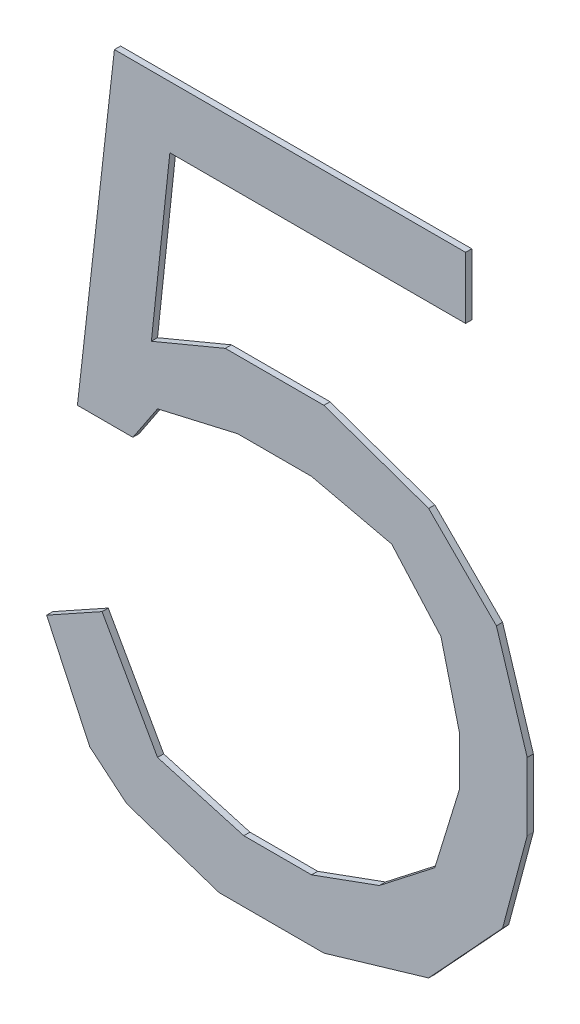
ISO-10303-21;
HEADER;
FILE_DESCRIPTION(('STEP AP214'),'2;1');
FILE_NAME('part.step','',(''),(''),'','','');
FILE_SCHEMA(('AUTOMOTIVE_DESIGN { 1 0 10303 214 1 1 1 1 }'));
ENDSEC;
DATA;
#1=APPLICATION_CONTEXT('core data for automotive mechanical design processes');
#2=APPLICATION_PROTOCOL_DEFINITION('international standard','automotive_design',2000,#1);
#3=PRODUCT_CONTEXT('',#1,'mechanical');
#4=PRODUCT('Part','Part','',(#3));
#5=PRODUCT_RELATED_PRODUCT_CATEGORY('part','',(#4));
#6=PRODUCT_DEFINITION_FORMATION('','',#4);
#7=PRODUCT_DEFINITION_CONTEXT('part definition',#1,'design');
#8=PRODUCT_DEFINITION('design','',#6,#7);
#9=PRODUCT_DEFINITION_SHAPE('','',#8);
#10=(LENGTH_UNIT() NAMED_UNIT(*) SI_UNIT(.MILLI.,.METRE.));
#11=(NAMED_UNIT(*) PLANE_ANGLE_UNIT() SI_UNIT($,.RADIAN.));
#12=(NAMED_UNIT(*) SI_UNIT($,.STERADIAN.) SOLID_ANGLE_UNIT());
#13=UNCERTAINTY_MEASURE_WITH_UNIT(LENGTH_MEASURE(1.E-05),#10,'distance_accuracy_value','');
#14=(GEOMETRIC_REPRESENTATION_CONTEXT(3) GLOBAL_UNCERTAINTY_ASSIGNED_CONTEXT((#13)) GLOBAL_UNIT_ASSIGNED_CONTEXT((#10,
#11,#12)) REPRESENTATION_CONTEXT('',''));
#15=CARTESIAN_POINT('',(0.,0.,0.));
#16=DIRECTION('',(0.,0.,1.));
#17=DIRECTION('',(1.,0.,0.));
#18=AXIS2_PLACEMENT_3D('',#15,#16,#17);
#19=CARTESIAN_POINT('',(0.28999942,0.55000144,0.01));
#20=DIRECTION('',(0.,0.,-1.));
#21=DIRECTION('',(0.,-1.,0.));
#22=AXIS2_PLACEMENT_3D('',#19,#20,#21);
#23=PLANE('',#22);
#24=DIRECTION('',(0.112488483006039,0.993653028572348,0.));
#25=VECTOR('',#24,1.);
#26=CARTESIAN_POINT('',(-0.33999932,0.01999995999999,0.01));
#27=LINE('',#26,#25);
#28=CARTESIAN_POINT('',(-0.33999932,0.01999996,0.01));
#29=VERTEX_POINT('',#28);
#30=CARTESIAN_POINT('',(-0.27999944,0.55000144,0.01));
#31=VERTEX_POINT('',#30);
#32=EDGE_CURVE('E481',#29,#31,#27,.T.);
#33=ORIENTED_EDGE('',*,*,#32,.F.);
#34=DIRECTION('',(-1.,0.,0.));
#35=VECTOR('',#34,1.);
#36=CARTESIAN_POINT('',(0.28999942,0.01999995999999,0.01));
#37=LINE('',#36,#35);
#38=CARTESIAN_POINT('',(-0.2499995,0.01999995999999,0.01));
#39=VERTEX_POINT('',#38);
#40=EDGE_CURVE('E333',#39,#29,#37,.T.);
#41=ORIENTED_EDGE('',*,*,#40,.F.);
#42=DIRECTION('',(-0.554700196224998,-0.832050294337998,0.));
#43=VECTOR('',#42,1.);
#44=CARTESIAN_POINT('',(-0.20999958,0.07999984,0.01));
#45=LINE('',#44,#43);
#46=CARTESIAN_POINT('',(-0.20999958,0.07999984,0.01));
#47=VERTEX_POINT('',#46);
#48=EDGE_CURVE('E330',#47,#39,#45,.T.);
#49=ORIENTED_EDGE('',*,*,#48,.F.);
#50=DIRECTION('',(-0.974391195694586,-0.224859506698904,0.));
#51=VECTOR('',#50,1.);
#52=CARTESIAN_POINT('',(-0.07999984,0.10999978,0.01));
#53=LINE('',#52,#51);
#54=CARTESIAN_POINT('',(-0.07999984,0.10999978,0.01));
#55=VERTEX_POINT('',#54);
#56=EDGE_CURVE('E478',#55,#47,#53,.T.);
#57=ORIENTED_EDGE('',*,*,#56,.F.);
#58=DIRECTION('',(-1.,0.,0.));
#59=VECTOR('',#58,1.);
#60=CARTESIAN_POINT('',(0.28999942,0.10999978,0.01));
#61=LINE('',#60,#59);
#62=CARTESIAN_POINT('',(0.03999992,0.10999978,0.01));
#63=VERTEX_POINT('',#62);
#64=EDGE_CURVE('E465',#63,#55,#61,.T.);
#65=ORIENTED_EDGE('',*,*,#64,.F.);
#66=DIRECTION('',(-0.974391195694586,0.224859506698904,0.));
#67=VECTOR('',#66,1.);
#68=CARTESIAN_POINT('',(0.16999966,0.07999984,0.01));
#69=LINE('',#68,#67);
#70=CARTESIAN_POINT('',(0.16999966,0.07999984,0.01));
#71=VERTEX_POINT('',#70);
#72=EDGE_CURVE('E466',#71,#63,#69,.T.);
#73=ORIENTED_EDGE('',*,*,#72,.F.);
#74=DIRECTION('',(-0.664363838829796,0.74740931868377,0.));
#75=VECTOR('',#74,1.);
#76=CARTESIAN_POINT('',(0.2499995,-0.009999980000003,0.01));
#77=LINE('',#76,#75);
#78=CARTESIAN_POINT('',(0.2499995,-0.009999980000006,0.01));
#79=VERTEX_POINT('',#78);
#80=EDGE_CURVE('E571',#79,#71,#77,.T.);
#81=ORIENTED_EDGE('',*,*,#80,.F.);
#82=DIRECTION('',(-0.242535625036098,0.970142500145391,0.));
#83=VECTOR('',#82,1.);
#84=CARTESIAN_POINT('',(0.27999944,-0.12999974,0.01));
#85=LINE('',#84,#83);
#86=CARTESIAN_POINT('',(0.27999944,-0.12999974,0.01));
#87=VERTEX_POINT('',#86);
#88=EDGE_CURVE('E510',#87,#79,#85,.T.);
#89=ORIENTED_EDGE('',*,*,#88,.F.);
#90=DIRECTION('',(0.,1.,0.));
#91=VECTOR('',#90,1.);
#92=CARTESIAN_POINT('',(0.27999944,0.55000144,0.01));
#93=LINE('',#92,#91);
#94=CARTESIAN_POINT('',(0.27999944,-0.20999958,0.01));
#95=VERTEX_POINT('',#94);
#96=EDGE_CURVE('E509',#95,#87,#93,.T.);
#97=ORIENTED_EDGE('',*,*,#96,.F.);
#98=DIRECTION('',(0.294085848837945,0.95577900872182,0.));
#99=VECTOR('',#98,1.);
#100=CARTESIAN_POINT('',(0.23999952,-0.33999932,0.01));
#101=LINE('',#100,#99);
#102=CARTESIAN_POINT('',(0.23999952,-0.33999932,0.01));
#103=VERTEX_POINT('',#102);
#104=EDGE_CURVE('E360',#103,#95,#101,.T.);
#105=ORIENTED_EDGE('',*,*,#104,.F.);
#106=DIRECTION('',(0.789352217376165,0.613940613515128,0.));
#107=VECTOR('',#106,1.);
#108=CARTESIAN_POINT('',(0.1499997,-0.40999918,0.01));
#109=LINE('',#108,#107);
#110=CARTESIAN_POINT('',(0.1499997,-0.40999918,0.01));
#111=VERTEX_POINT('',#110);
#112=EDGE_CURVE('E406',#111,#103,#109,.T.);
#113=ORIENTED_EDGE('',*,*,#112,.F.);
#114=DIRECTION('',(0.939793423488291,0.341743063087106,0.));
#115=VECTOR('',#114,1.);
#116=CARTESIAN_POINT('',(0.03999992,-0.4499991,0.01));
#117=LINE('',#116,#115);
#118=CARTESIAN_POINT('',(0.03999992,-0.4499991,0.01));
#119=VERTEX_POINT('',#118);
#120=EDGE_CURVE('E370',#119,#111,#117,.T.);
#121=ORIENTED_EDGE('',*,*,#120,.F.);
#122=DIRECTION('',(1.,0.,0.));
#123=VECTOR('',#122,1.);
#124=CARTESIAN_POINT('',(0.28999942,-0.4499991,0.01));
#125=LINE('',#124,#123);
#126=CARTESIAN_POINT('',(-0.06999986,-0.4499991,0.01));
#127=VERTEX_POINT('',#126);
#128=EDGE_CURVE('E519',#127,#119,#125,.T.);
#129=ORIENTED_EDGE('',*,*,#128,.F.);
#130=DIRECTION('',(0.961523947640936,-0.274721127896982,0.));
#131=VECTOR('',#130,1.);
#132=CARTESIAN_POINT('',(-0.20999958,-0.40999918,0.01));
#133=LINE('',#132,#131);
#134=CARTESIAN_POINT('',(-0.20999958,-0.40999918,0.01));
#135=VERTEX_POINT('',#134);
#136=EDGE_CURVE('E458',#135,#127,#133,.T.);
#137=ORIENTED_EDGE('',*,*,#136,.F.);
#138=DIRECTION('',(0.490261239632702,-0.871575537124469,0.));
#139=VECTOR('',#138,1.);
#140=CARTESIAN_POINT('',(-0.2999994,-0.2499995,0.01));
#141=LINE('',#140,#139);
#142=CARTESIAN_POINT('',(-0.2999994,-0.2499995,0.01));
#143=VERTEX_POINT('',#142);
#144=EDGE_CURVE('E459',#143,#135,#141,.T.);
#145=ORIENTED_EDGE('',*,*,#144,.F.);
#146=DIRECTION('',(0.874157276121491,0.485642931178717,0.));
#147=VECTOR('',#146,1.);
#148=CARTESIAN_POINT('',(-0.38999922,-0.2999994,0.01));
#149=LINE('',#148,#147);
#150=CARTESIAN_POINT('',(-0.38999922,-0.2999994,0.01));
#151=VERTEX_POINT('',#150);
#152=EDGE_CURVE('E612',#151,#143,#149,.T.);
#153=ORIENTED_EDGE('',*,*,#152,.F.);
#154=DIRECTION('',(-0.422885465331124,0.906183139995265,0.));
#155=VECTOR('',#154,1.);
#156=CARTESIAN_POINT('',(-0.31999936,-0.4499991,0.01));
#157=LINE('',#156,#155);
#158=CARTESIAN_POINT('',(-0.31999936,-0.4499991,0.01));
#159=VERTEX_POINT('',#158);
#160=EDGE_CURVE('E381',#159,#151,#157,.T.);
#161=ORIENTED_EDGE('',*,*,#160,.F.);
#162=DIRECTION('',(-0.768221279597458,0.640184399664382,0.));
#163=VECTOR('',#162,1.);
#164=CARTESIAN_POINT('',(-0.25999948,-0.499999,0.01));
#165=LINE('',#164,#163);
#166=CARTESIAN_POINT('',(-0.25999948,-0.499999,0.01));
#167=VERTEX_POINT('',#166);
#168=EDGE_CURVE('E450',#167,#159,#165,.T.);
#169=ORIENTED_EDGE('',*,*,#168,.F.);
#170=DIRECTION('',(-0.948683298050514,0.316227766016838,0.));
#171=VECTOR('',#170,1.);
#172=CARTESIAN_POINT('',(-0.10999978,-0.5499989,0.01));
#173=LINE('',#172,#171);
#174=CARTESIAN_POINT('',(-0.10999978,-0.5499989,0.01));
#175=VERTEX_POINT('',#174);
#176=EDGE_CURVE('E605',#175,#167,#173,.T.);
#177=ORIENTED_EDGE('',*,*,#176,.F.);
#178=DIRECTION('',(-1.,0.,0.));
#179=VECTOR('',#178,1.);
#180=CARTESIAN_POINT('',(0.28999942,-0.5499989,0.01));
#181=LINE('',#180,#179);
#182=CARTESIAN_POINT('',(0.05999988000001,-0.5499989,0.01));
#183=VERTEX_POINT('',#182);
#184=EDGE_CURVE('E359',#183,#175,#181,.T.);
#185=ORIENTED_EDGE('',*,*,#184,.F.);
#186=DIRECTION('',(-0.959365501571127,-0.282166323992038,0.));
#187=VECTOR('',#186,1.);
#188=CARTESIAN_POINT('',(0.22999954,-0.499999,0.01));
#189=LINE('',#188,#187);
#190=CARTESIAN_POINT('',(0.22999954,-0.499999,0.01));
#191=VERTEX_POINT('',#190);
#192=EDGE_CURVE('E351',#191,#183,#189,.T.);
#193=ORIENTED_EDGE('',*,*,#192,.F.);
#194=DIRECTION('',(-0.678280102733274,-0.734803444627296,0.));
#195=VECTOR('',#194,1.);
#196=CARTESIAN_POINT('',(0.3499993,-0.36999926,0.01));
#197=LINE('',#196,#195);
#198=CARTESIAN_POINT('',(0.3499993,-0.36999926,0.01));
#199=VERTEX_POINT('',#198);
#200=EDGE_CURVE('E518',#199,#191,#197,.T.);
#201=ORIENTED_EDGE('',*,*,#200,.F.);
#202=DIRECTION('',(-0.257662650560083,-0.966234939601313,0.));
#203=VECTOR('',#202,1.);
#204=CARTESIAN_POINT('',(0.38999922,-0.21999956,0.01));
#205=LINE('',#204,#203);
#206=CARTESIAN_POINT('',(0.38999922,-0.21999956,0.01));
#207=VERTEX_POINT('',#206);
#208=EDGE_CURVE('E416',#207,#199,#205,.T.);
#209=ORIENTED_EDGE('',*,*,#208,.F.);
#210=DIRECTION('',(0.,-1.,0.));
#211=VECTOR('',#210,1.);
#212=CARTESIAN_POINT('',(0.38999922,0.55000144,0.01));
#213=LINE('',#212,#211);
#214=CARTESIAN_POINT('',(0.38999922,-0.10999978,0.01));
#215=VERTEX_POINT('',#214);
#216=EDGE_CURVE('E410',#215,#207,#213,.T.);
#217=ORIENTED_EDGE('',*,*,#216,.F.);
#218=DIRECTION('',(0.298274993136004,-0.954479978035012,0.));
#219=VECTOR('',#218,1.);
#220=CARTESIAN_POINT('',(0.33999932,0.04999989999999,0.01));
#221=LINE('',#220,#219);
#222=CARTESIAN_POINT('',(0.33999932,0.04999989999999,0.01));
#223=VERTEX_POINT('',#222);
#224=EDGE_CURVE('E303',#223,#215,#221,.T.);
#225=ORIENTED_EDGE('',*,*,#224,.F.);
#226=DIRECTION('',(0.707098617347921,-0.707114944930921,0.));
#227=VECTOR('',#226,1.);
#228=CARTESIAN_POINT('',(0.22999954,0.16000222,0.01));
#229=LINE('',#228,#227);
#230=CARTESIAN_POINT('',(0.22999954,0.16000222,0.01));
#231=VERTEX_POINT('',#230);
#232=EDGE_CURVE('E296',#231,#223,#229,.T.);
#233=ORIENTED_EDGE('',*,*,#232,.F.);
#234=DIRECTION('',(0.942990333582945,-0.332820117734981,0.));
#235=VECTOR('',#234,1.);
#236=CARTESIAN_POINT('',(0.05999988000001,0.2200021,0.01));
#237=LINE('',#236,#235);
#238=CARTESIAN_POINT('',(0.05999988000001,0.2200021,0.01));
#239=VERTEX_POINT('',#238);
#240=EDGE_CURVE('E299',#239,#231,#237,.T.);
#241=ORIENTED_EDGE('',*,*,#240,.F.);
#242=DIRECTION('',(1.,0.,0.));
#243=VECTOR('',#242,1.);
#244=CARTESIAN_POINT('',(0.28999942,0.2200021,0.01));
#245=LINE('',#244,#243);
#246=CARTESIAN_POINT('',(-0.09999979999999,0.2200021,0.01));
#247=VERTEX_POINT('',#246);
#248=EDGE_CURVE('E327',#247,#239,#245,.T.);
#249=ORIENTED_EDGE('',*,*,#248,.F.);
#250=DIRECTION('',(0.923076923077071,0.38461538461503,0.));
#251=VECTOR('',#250,1.);
#252=CARTESIAN_POINT('',(-0.21999956,0.1700022,0.01));
#253=LINE('',#252,#251);
#254=CARTESIAN_POINT('',(-0.21999956,0.1700022,0.01));
#255=VERTEX_POINT('',#254);
#256=EDGE_CURVE('E495',#255,#247,#253,.T.);
#257=ORIENTED_EDGE('',*,*,#256,.F.);
#258=DIRECTION('',(-0.106533123633983,-0.994309153919839,0.));
#259=VECTOR('',#258,1.);
#260=CARTESIAN_POINT('',(-0.18999962,0.45000164,0.01));
#261=LINE('',#260,#259);
#262=CARTESIAN_POINT('',(-0.18999962,0.45000164,0.01));
#263=VERTEX_POINT('',#262);
#264=EDGE_CURVE('E502',#263,#255,#261,.T.);
#265=ORIENTED_EDGE('',*,*,#264,.F.);
#266=DIRECTION('',(-1.,0.,0.));
#267=VECTOR('',#266,1.);
#268=CARTESIAN_POINT('',(0.28999942,0.45000164,0.01));
#269=LINE('',#268,#267);
#270=CARTESIAN_POINT('',(0.28999942,0.45000164,0.01));
#271=VERTEX_POINT('',#270);
#272=EDGE_CURVE('E487',#271,#263,#269,.T.);
#273=ORIENTED_EDGE('',*,*,#272,.F.);
#274=DIRECTION('',(0.,-1.,0.));
#275=VECTOR('',#274,1.);
#276=CARTESIAN_POINT('',(0.28999942,0.55000144,0.01));
#277=LINE('',#276,#275);
#278=CARTESIAN_POINT('',(0.28999942,0.55000144,0.01));
#279=VERTEX_POINT('',#278);
#280=EDGE_CURVE('E437',#279,#271,#277,.T.);
#281=ORIENTED_EDGE('',*,*,#280,.F.);
#282=DIRECTION('',(1.,0.,0.));
#283=VECTOR('',#282,1.);
#284=CARTESIAN_POINT('',(0.28999942,0.55000144,0.01));
#285=LINE('',#284,#283);
#286=EDGE_CURVE('E11',#31,#279,#285,.T.);
#287=ORIENTED_EDGE('',*,*,#286,.F.);
#288=EDGE_LOOP('',(#33,#41,#49,#57,#65,#73,#81,#89,#97,#105,#113,#121,#129,#137,#145,#153,#161,
#169,#177,#185,#193,#201,#209,#217,#225,#233,#241,#249,#257,#265,#273,#281,#287));
#289=FACE_BOUND('',#288,.T.);
#290=ADVANCED_FACE('F17',(#289),#23,.F.);
#291=CARTESIAN_POINT('',(0.28999942,0.55000144,0.));
#292=DIRECTION('',(0.,-1.,0.));
#293=DIRECTION('',(0.,0.,-1.));
#294=AXIS2_PLACEMENT_3D('',#291,#292,#293);
#295=PLANE('',#294);
#296=DIRECTION('',(0.,0.,-1.));
#297=VECTOR('',#296,1.);
#298=CARTESIAN_POINT('',(-0.27999944,0.55000144,0.));
#299=LINE('',#298,#297);
#300=CARTESIAN_POINT('',(-0.27999944,0.55000144,0.));
#301=VERTEX_POINT('',#300);
#302=EDGE_CURVE('E28',#31,#301,#299,.T.);
#303=ORIENTED_EDGE('',*,*,#302,.F.);
#304=ORIENTED_EDGE('',*,*,#286,.T.);
#305=DIRECTION('',(0.,0.,1.));
#306=VECTOR('',#305,1.);
#307=CARTESIAN_POINT('',(0.28999942,0.55000144,0.));
#308=LINE('',#307,#306);
#309=CARTESIAN_POINT('',(0.28999942,0.55000144,0.));
#310=VERTEX_POINT('',#309);
#311=EDGE_CURVE('E433',#310,#279,#308,.T.);
#312=ORIENTED_EDGE('',*,*,#311,.F.);
#313=DIRECTION('',(1.,0.,0.));
#314=VECTOR('',#313,1.);
#315=CARTESIAN_POINT('',(0.28999942,0.55000144,0.));
#316=LINE('',#315,#314);
#317=EDGE_CURVE('E403',#301,#310,#316,.T.);
#318=ORIENTED_EDGE('',*,*,#317,.F.);
#319=EDGE_LOOP('',(#303,#304,#312,#318));
#320=FACE_BOUND('',#319,.T.);
#321=ADVANCED_FACE('F757',(#320),#295,.F.);
#322=CARTESIAN_POINT('',(-0.27999944,0.55000144,0.));
#323=DIRECTION('',(0.993653028572348,-0.112488483006039,0.));
#324=DIRECTION('',(0.,0.,-1.));
#325=AXIS2_PLACEMENT_3D('',#322,#323,#324);
#326=PLANE('',#325);
#327=DIRECTION('',(0.,0.,-1.));
#328=VECTOR('',#327,1.);
#329=CARTESIAN_POINT('',(-0.33999932,0.01999996000001,0.));
#330=LINE('',#329,#328);
#331=CARTESIAN_POINT('',(-0.33999932,0.01999996,0.));
#332=VERTEX_POINT('',#331);
#333=EDGE_CURVE('E337',#29,#332,#330,.T.);
#334=ORIENTED_EDGE('',*,*,#333,.F.);
#335=ORIENTED_EDGE('',*,*,#32,.T.);
#336=ORIENTED_EDGE('',*,*,#302,.T.);
#337=DIRECTION('',(0.112488483006039,0.993653028572348,0.));
#338=VECTOR('',#337,1.);
#339=CARTESIAN_POINT('',(-0.27999944,0.55000144,0.));
#340=LINE('',#339,#338);
#341=EDGE_CURVE('E399',#332,#301,#340,.T.);
#342=ORIENTED_EDGE('',*,*,#341,.F.);
#343=EDGE_LOOP('',(#334,#335,#336,#342));
#344=FACE_BOUND('',#343,.T.);
#345=ADVANCED_FACE('F754',(#344),#326,.F.);
#346=CARTESIAN_POINT('',(-0.33999932,0.01999995999999,0.));
#347=DIRECTION('',(0.,1.,0.));
#348=DIRECTION('',(1.,0.,0.));
#349=AXIS2_PLACEMENT_3D('',#346,#347,#348);
#350=PLANE('',#349);
#351=DIRECTION('',(0.,0.,-1.));
#352=VECTOR('',#351,1.);
#353=CARTESIAN_POINT('',(-0.2499995,0.01999995999999,0.));
#354=LINE('',#353,#352);
#355=CARTESIAN_POINT('',(-0.2499995,0.01999995999999,0.));
#356=VERTEX_POINT('',#355);
#357=EDGE_CURVE('E338',#39,#356,#354,.T.);
#358=ORIENTED_EDGE('',*,*,#357,.F.);
#359=ORIENTED_EDGE('',*,*,#40,.T.);
#360=ORIENTED_EDGE('',*,*,#333,.T.);
#361=DIRECTION('',(-1.,0.,0.));
#362=VECTOR('',#361,1.);
#363=CARTESIAN_POINT('',(-0.33999932,0.01999995999999,0.));
#364=LINE('',#363,#362);
#365=EDGE_CURVE('E379',#356,#332,#364,.T.);
#366=ORIENTED_EDGE('',*,*,#365,.F.);
#367=EDGE_LOOP('',(#358,#359,#360,#366));
#368=FACE_BOUND('',#367,.T.);
#369=ADVANCED_FACE('F750',(#368),#350,.F.);
#370=CARTESIAN_POINT('',(-0.2499995,0.01999995999999,0.));
#371=DIRECTION('',(-0.832050294337998,0.554700196224998,0.));
#372=DIRECTION('',(0.,0.,1.));
#373=AXIS2_PLACEMENT_3D('',#370,#371,#372);
#374=PLANE('',#373);
#375=DIRECTION('',(0.,0.,-1.));
#376=VECTOR('',#375,1.);
#377=CARTESIAN_POINT('',(-0.20999958,0.07999984000001,0.));
#378=LINE('',#377,#376);
#379=CARTESIAN_POINT('',(-0.20999958,0.07999984,0.));
#380=VERTEX_POINT('',#379);
#381=EDGE_CURVE('E475',#47,#380,#378,.T.);
#382=ORIENTED_EDGE('',*,*,#381,.F.);
#383=ORIENTED_EDGE('',*,*,#48,.T.);
#384=ORIENTED_EDGE('',*,*,#357,.T.);
#385=DIRECTION('',(-0.554700196224998,-0.832050294337998,0.));
#386=VECTOR('',#385,1.);
#387=CARTESIAN_POINT('',(-0.2499995,0.01999995999999,0.));
#388=LINE('',#387,#386);
#389=EDGE_CURVE('E375',#380,#356,#388,.T.);
#390=ORIENTED_EDGE('',*,*,#389,.F.);
#391=EDGE_LOOP('',(#382,#383,#384,#390));
#392=FACE_BOUND('',#391,.T.);
#393=ADVANCED_FACE('F746',(#392),#374,.F.);
#394=CARTESIAN_POINT('',(-0.20999958,0.07999984,0.));
#395=DIRECTION('',(-0.224859506698904,0.974391195694586,0.));
#396=DIRECTION('',(0.,0.,1.));
#397=AXIS2_PLACEMENT_3D('',#394,#395,#396);
#398=PLANE('',#397);
#399=DIRECTION('',(0.,0.,-1.));
#400=VECTOR('',#399,1.);
#401=CARTESIAN_POINT('',(-0.07999984,0.10999978,0.));
#402=LINE('',#401,#400);
#403=CARTESIAN_POINT('',(-0.07999984,0.10999978,0.));
#404=VERTEX_POINT('',#403);
#405=EDGE_CURVE('E541',#55,#404,#402,.T.);
#406=ORIENTED_EDGE('',*,*,#405,.F.);
#407=ORIENTED_EDGE('',*,*,#56,.T.);
#408=ORIENTED_EDGE('',*,*,#381,.T.);
#409=DIRECTION('',(-0.974391195694586,-0.224859506698904,0.));
#410=VECTOR('',#409,1.);
#411=CARTESIAN_POINT('',(-0.20999958,0.07999984,0.));
#412=LINE('',#411,#410);
#413=EDGE_CURVE('E380',#404,#380,#412,.T.);
#414=ORIENTED_EDGE('',*,*,#413,.F.);
#415=EDGE_LOOP('',(#406,#407,#408,#414));
#416=FACE_BOUND('',#415,.T.);
#417=ADVANCED_FACE('F742',(#416),#398,.F.);
#418=CARTESIAN_POINT('',(-0.07999984,0.10999978,0.));
#419=DIRECTION('',(0.,1.,0.));
#420=DIRECTION('',(1.,0.,0.));
#421=AXIS2_PLACEMENT_3D('',#418,#419,#420);
#422=PLANE('',#421);
#423=DIRECTION('',(0.,0.,-1.));
#424=VECTOR('',#423,1.);
#425=CARTESIAN_POINT('',(0.03999992,0.10999978,0.));
#426=LINE('',#425,#424);
#427=CARTESIAN_POINT('',(0.03999992,0.10999978,0.));
#428=VERTEX_POINT('',#427);
#429=EDGE_CURVE('E462',#63,#428,#426,.T.);
#430=ORIENTED_EDGE('',*,*,#429,.F.);
#431=ORIENTED_EDGE('',*,*,#64,.T.);
#432=ORIENTED_EDGE('',*,*,#405,.T.);
#433=DIRECTION('',(-1.,0.,0.));
#434=VECTOR('',#433,1.);
#435=CARTESIAN_POINT('',(-0.07999984,0.10999978,0.));
#436=LINE('',#435,#434);
#437=EDGE_CURVE('E343',#428,#404,#436,.T.);
#438=ORIENTED_EDGE('',*,*,#437,.F.);
#439=EDGE_LOOP('',(#430,#431,#432,#438));
#440=FACE_BOUND('',#439,.T.);
#441=ADVANCED_FACE('F740',(#440),#422,.F.);
#442=CARTESIAN_POINT('',(0.03999992,0.10999978,0.));
#443=DIRECTION('',(0.224859506698904,0.974391195694586,0.));
#444=DIRECTION('',(0.,0.,-1.));
#445=AXIS2_PLACEMENT_3D('',#442,#443,#444);
#446=PLANE('',#445);
#447=DIRECTION('',(0.,0.,-1.));
#448=VECTOR('',#447,1.);
#449=CARTESIAN_POINT('',(0.16999966,0.07999983999998,0.));
#450=LINE('',#449,#448);
#451=CARTESIAN_POINT('',(0.16999966,0.07999984,0.));
#452=VERTEX_POINT('',#451);
#453=EDGE_CURVE('E574',#71,#452,#450,.T.);
#454=ORIENTED_EDGE('',*,*,#453,.F.);
#455=ORIENTED_EDGE('',*,*,#72,.T.);
#456=ORIENTED_EDGE('',*,*,#429,.T.);
#457=DIRECTION('',(-0.974391195694586,0.224859506698904,0.));
#458=VECTOR('',#457,1.);
#459=CARTESIAN_POINT('',(0.03999992,0.10999978,0.));
#460=LINE('',#459,#458);
#461=EDGE_CURVE('E339',#452,#428,#460,.T.);
#462=ORIENTED_EDGE('',*,*,#461,.F.);
#463=EDGE_LOOP('',(#454,#455,#456,#462));
#464=FACE_BOUND('',#463,.T.);
#465=ADVANCED_FACE('F738',(#464),#446,.F.);
#466=CARTESIAN_POINT('',(0.16999966,0.07999984,0.));
#467=DIRECTION('',(0.74740931868377,0.664363838829796,0.));
#468=DIRECTION('',(0.,0.,-1.));
#469=AXIS2_PLACEMENT_3D('',#466,#467,#468);
#470=PLANE('',#469);
#471=DIRECTION('',(0.,0.,-1.));
#472=VECTOR('',#471,1.);
#473=CARTESIAN_POINT('',(0.2499995,-0.009999980000015,0.));
#474=LINE('',#473,#472);
#475=CARTESIAN_POINT('',(0.2499995,-0.009999980000006,0.));
#476=VERTEX_POINT('',#475);
#477=EDGE_CURVE('E514',#79,#476,#474,.T.);
#478=ORIENTED_EDGE('',*,*,#477,.F.);
#479=ORIENTED_EDGE('',*,*,#80,.T.);
#480=ORIENTED_EDGE('',*,*,#453,.T.);
#481=DIRECTION('',(-0.664363838829796,0.74740931868377,0.));
#482=VECTOR('',#481,1.);
#483=CARTESIAN_POINT('',(0.16999966,0.07999984,0.));
#484=LINE('',#483,#482);
#485=EDGE_CURVE('E344',#476,#452,#484,.T.);
#486=ORIENTED_EDGE('',*,*,#485,.F.);
#487=EDGE_LOOP('',(#478,#479,#480,#486));
#488=FACE_BOUND('',#487,.T.);
#489=ADVANCED_FACE('F735',(#488),#470,.F.);
#490=CARTESIAN_POINT('',(0.2499995,-0.009999980000003,0.));
#491=DIRECTION('',(0.970142500145391,0.242535625036098,0.));
#492=DIRECTION('',(0.,0.,-1.));
#493=AXIS2_PLACEMENT_3D('',#490,#491,#492);
#494=PLANE('',#493);
#495=DIRECTION('',(0.,0.,-1.));
#496=VECTOR('',#495,1.);
#497=CARTESIAN_POINT('',(0.27999944,-0.12999974,0.));
#498=LINE('',#497,#496);
#499=CARTESIAN_POINT('',(0.27999944,-0.12999974,0.));
#500=VERTEX_POINT('',#499);
#501=EDGE_CURVE('E515',#87,#500,#498,.T.);
#502=ORIENTED_EDGE('',*,*,#501,.F.);
#503=ORIENTED_EDGE('',*,*,#88,.T.);
#504=ORIENTED_EDGE('',*,*,#477,.T.);
#505=DIRECTION('',(-0.242535625036098,0.970142500145391,0.));
#506=VECTOR('',#505,1.);
#507=CARTESIAN_POINT('',(0.2499995,-0.009999980000003,0.));
#508=LINE('',#507,#506);
#509=EDGE_CURVE('E523',#500,#476,#508,.T.);
#510=ORIENTED_EDGE('',*,*,#509,.F.);
#511=EDGE_LOOP('',(#502,#503,#504,#510));
#512=FACE_BOUND('',#511,.T.);
#513=ADVANCED_FACE('F730',(#512),#494,.F.);
#514=CARTESIAN_POINT('',(0.27999944,-0.12999974,0.));
#515=DIRECTION('',(1.,0.,0.));
#516=DIRECTION('',(0.,1.,0.));
#517=AXIS2_PLACEMENT_3D('',#514,#515,#516);
#518=PLANE('',#517);
#519=DIRECTION('',(0.,0.,-1.));
#520=VECTOR('',#519,1.);
#521=CARTESIAN_POINT('',(0.27999944,-0.20999958,0.));
#522=LINE('',#521,#520);
#523=CARTESIAN_POINT('',(0.27999944,-0.20999958,0.));
#524=VERTEX_POINT('',#523);
#525=EDGE_CURVE('E364',#95,#524,#522,.T.);
#526=ORIENTED_EDGE('',*,*,#525,.F.);
#527=ORIENTED_EDGE('',*,*,#96,.T.);
#528=ORIENTED_EDGE('',*,*,#501,.T.);
#529=DIRECTION('',(0.,1.,0.));
#530=VECTOR('',#529,1.);
#531=CARTESIAN_POINT('',(0.27999944,-0.12999974,0.));
#532=LINE('',#531,#530);
#533=EDGE_CURVE('E527',#524,#500,#532,.T.);
#534=ORIENTED_EDGE('',*,*,#533,.F.);
#535=EDGE_LOOP('',(#526,#527,#528,#534));
#536=FACE_BOUND('',#535,.T.);
#537=ADVANCED_FACE('F726',(#536),#518,.F.);
#538=CARTESIAN_POINT('',(0.27999944,-0.20999958,0.));
#539=DIRECTION('',(0.95577900872182,-0.294085848837945,0.));
#540=DIRECTION('',(0.,0.,-1.));
#541=AXIS2_PLACEMENT_3D('',#538,#539,#540);
#542=PLANE('',#541);
#543=DIRECTION('',(0.,0.,-1.));
#544=VECTOR('',#543,1.);
#545=CARTESIAN_POINT('',(0.23999952,-0.33999932,0.));
#546=LINE('',#545,#544);
#547=CARTESIAN_POINT('',(0.23999952,-0.33999932,0.));
#548=VERTEX_POINT('',#547);
#549=EDGE_CURVE('E365',#103,#548,#546,.T.);
#550=ORIENTED_EDGE('',*,*,#549,.F.);
#551=ORIENTED_EDGE('',*,*,#104,.T.);
#552=ORIENTED_EDGE('',*,*,#525,.T.);
#553=DIRECTION('',(0.294085848837945,0.95577900872182,0.));
#554=VECTOR('',#553,1.);
#555=CARTESIAN_POINT('',(0.27999944,-0.20999958,0.));
#556=LINE('',#555,#554);
#557=EDGE_CURVE('E595',#548,#524,#556,.T.);
#558=ORIENTED_EDGE('',*,*,#557,.F.);
#559=EDGE_LOOP('',(#550,#551,#552,#558));
#560=FACE_BOUND('',#559,.T.);
#561=ADVANCED_FACE('F723',(#560),#542,.F.);
#562=CARTESIAN_POINT('',(0.23999952,-0.33999932,0.));
#563=DIRECTION('',(0.613940613515128,-0.789352217376165,0.));
#564=DIRECTION('',(0.,0.,-1.));
#565=AXIS2_PLACEMENT_3D('',#562,#563,#564);
#566=PLANE('',#565);
#567=DIRECTION('',(0.,0.,-1.));
#568=VECTOR('',#567,1.);
#569=CARTESIAN_POINT('',(0.1499997,-0.40999918,0.));
#570=LINE('',#569,#568);
#571=CARTESIAN_POINT('',(0.1499997,-0.40999918,0.));
#572=VERTEX_POINT('',#571);
#573=EDGE_CURVE('E374',#111,#572,#570,.T.);
#574=ORIENTED_EDGE('',*,*,#573,.F.);
#575=ORIENTED_EDGE('',*,*,#112,.T.);
#576=ORIENTED_EDGE('',*,*,#549,.T.);
#577=DIRECTION('',(0.789352217376165,0.613940613515128,0.));
#578=VECTOR('',#577,1.);
#579=CARTESIAN_POINT('',(0.23999952,-0.33999932,0.));
#580=LINE('',#579,#578);
#581=EDGE_CURVE('E554',#572,#548,#580,.T.);
#582=ORIENTED_EDGE('',*,*,#581,.F.);
#583=EDGE_LOOP('',(#574,#575,#576,#582));
#584=FACE_BOUND('',#583,.T.);
#585=ADVANCED_FACE('F718',(#584),#566,.F.);
#586=CARTESIAN_POINT('',(0.1499997,-0.40999918,0.));
#587=DIRECTION('',(0.341743063087106,-0.939793423488291,0.));
#588=DIRECTION('',(0.,0.,-1.));
#589=AXIS2_PLACEMENT_3D('',#586,#587,#588);
#590=PLANE('',#589);
#591=DIRECTION('',(0.,0.,-1.));
#592=VECTOR('',#591,1.);
#593=CARTESIAN_POINT('',(0.03999992000002,-0.4499991,0.));
#594=LINE('',#593,#592);
#595=CARTESIAN_POINT('',(0.03999992,-0.4499991,0.));
#596=VERTEX_POINT('',#595);
#597=EDGE_CURVE('E21',#119,#596,#594,.T.);
#598=ORIENTED_EDGE('',*,*,#597,.F.);
#599=ORIENTED_EDGE('',*,*,#120,.T.);
#600=ORIENTED_EDGE('',*,*,#573,.T.);
#601=DIRECTION('',(0.939793423488291,0.341743063087106,0.));
#602=VECTOR('',#601,1.);
#603=CARTESIAN_POINT('',(0.1499997,-0.40999918,0.));
#604=LINE('',#603,#602);
#605=EDGE_CURVE('E446',#596,#572,#604,.T.);
#606=ORIENTED_EDGE('',*,*,#605,.F.);
#607=EDGE_LOOP('',(#598,#599,#600,#606));
#608=FACE_BOUND('',#607,.T.);
#609=ADVANCED_FACE('F714',(#608),#590,.F.);
#610=CARTESIAN_POINT('',(0.03999992,-0.4499991,0.));
#611=DIRECTION('',(0.,-1.,0.));
#612=DIRECTION('',(0.,0.,-1.));
#613=AXIS2_PLACEMENT_3D('',#610,#611,#612);
#614=PLANE('',#613);
#615=DIRECTION('',(0.,0.,-1.));
#616=VECTOR('',#615,1.);
#617=CARTESIAN_POINT('',(-0.06999986,-0.4499991,0.));
#618=LINE('',#617,#616);
#619=CARTESIAN_POINT('',(-0.06999986,-0.4499991,0.));
#620=VERTEX_POINT('',#619);
#621=EDGE_CURVE('E491',#127,#620,#618,.T.);
#622=ORIENTED_EDGE('',*,*,#621,.F.);
#623=ORIENTED_EDGE('',*,*,#128,.T.);
#624=ORIENTED_EDGE('',*,*,#597,.T.);
#625=DIRECTION('',(1.,0.,0.));
#626=VECTOR('',#625,1.);
#627=CARTESIAN_POINT('',(0.03999992,-0.4499991,0.));
#628=LINE('',#627,#626);
#629=EDGE_CURVE('E442',#620,#596,#628,.T.);
#630=ORIENTED_EDGE('',*,*,#629,.F.);
#631=EDGE_LOOP('',(#622,#623,#624,#630));
#632=FACE_BOUND('',#631,.T.);
#633=ADVANCED_FACE('F711',(#632),#614,.F.);
#634=CARTESIAN_POINT('',(-0.06999986,-0.4499991,0.));
#635=DIRECTION('',(-0.274721127896982,-0.961523947640936,0.));
#636=DIRECTION('',(-0.961523947640936,0.274721127896982,0.));
#637=AXIS2_PLACEMENT_3D('',#634,#635,#636);
#638=PLANE('',#637);
#639=DIRECTION('',(0.,0.,-1.));
#640=VECTOR('',#639,1.);
#641=CARTESIAN_POINT('',(-0.20999958,-0.40999918,0.));
#642=LINE('',#641,#640);
#643=CARTESIAN_POINT('',(-0.20999958,-0.40999918,0.));
#644=VERTEX_POINT('',#643);
#645=EDGE_CURVE('E455',#135,#644,#642,.T.);
#646=ORIENTED_EDGE('',*,*,#645,.F.);
#647=ORIENTED_EDGE('',*,*,#136,.T.);
#648=ORIENTED_EDGE('',*,*,#621,.T.);
#649=DIRECTION('',(0.961523947640936,-0.274721127896982,0.));
#650=VECTOR('',#649,1.);
#651=CARTESIAN_POINT('',(-0.06999986,-0.4499991,0.));
#652=LINE('',#651,#650);
#653=EDGE_CURVE('E447',#644,#620,#652,.T.);
#654=ORIENTED_EDGE('',*,*,#653,.F.);
#655=EDGE_LOOP('',(#646,#647,#648,#654));
#656=FACE_BOUND('',#655,.T.);
#657=ADVANCED_FACE('F706',(#656),#638,.F.);
#658=CARTESIAN_POINT('',(-0.20999958,-0.40999918,0.));
#659=DIRECTION('',(-0.871575537124229,-0.490261239633129,0.));
#660=DIRECTION('',(-0.490261239633129,0.871575537124229,0.));
#661=AXIS2_PLACEMENT_3D('',#658,#659,#660);
#662=PLANE('',#661);
#663=DIRECTION('',(0.,0.,-1.));
#664=VECTOR('',#663,1.);
#665=CARTESIAN_POINT('',(-0.2999994,-0.2499995,0.));
#666=LINE('',#665,#664);
#667=CARTESIAN_POINT('',(-0.2999994,-0.2499995,0.));
#668=VERTEX_POINT('',#667);
#669=EDGE_CURVE('E470',#143,#668,#666,.T.);
#670=ORIENTED_EDGE('',*,*,#669,.F.);
#671=ORIENTED_EDGE('',*,*,#144,.T.);
#672=ORIENTED_EDGE('',*,*,#645,.T.);
#673=DIRECTION('',(0.490261239633129,-0.871575537124229,0.));
#674=VECTOR('',#673,1.);
#675=CARTESIAN_POINT('',(-0.20999958,-0.40999918,0.));
#676=LINE('',#675,#674);
#677=EDGE_CURVE('E454',#668,#644,#676,.T.);
#678=ORIENTED_EDGE('',*,*,#677,.F.);
#679=EDGE_LOOP('',(#670,#671,#672,#678));
#680=FACE_BOUND('',#679,.T.);
#681=ADVANCED_FACE('F702',(#680),#662,.F.);
#682=CARTESIAN_POINT('',(-0.2999994,-0.2499995,0.));
#683=DIRECTION('',(0.485642931179142,-0.874157276121255,0.));
#684=DIRECTION('',(0.,0.,-1.));
#685=AXIS2_PLACEMENT_3D('',#682,#683,#684);
#686=PLANE('',#685);
#687=DIRECTION('',(0.,0.,-1.));
#688=VECTOR('',#687,1.);
#689=CARTESIAN_POINT('',(-0.38999922,-0.2999994,0.));
#690=LINE('',#689,#688);
#691=CARTESIAN_POINT('',(-0.38999922,-0.2999994,0.));
#692=VERTEX_POINT('',#691);
#693=EDGE_CURVE('E385',#151,#692,#690,.T.);
#694=ORIENTED_EDGE('',*,*,#693,.F.);
#695=ORIENTED_EDGE('',*,*,#152,.T.);
#696=ORIENTED_EDGE('',*,*,#669,.T.);
#697=DIRECTION('',(0.874157276121255,0.485642931179142,0.));
#698=VECTOR('',#697,1.);
#699=CARTESIAN_POINT('',(-0.2999994,-0.2499995,0.));
#700=LINE('',#699,#698);
#701=EDGE_CURVE('E391',#692,#668,#700,.T.);
#702=ORIENTED_EDGE('',*,*,#701,.F.);
#703=EDGE_LOOP('',(#694,#695,#696,#702));
#704=FACE_BOUND('',#703,.T.);
#705=ADVANCED_FACE('F699',(#704),#686,.F.);
#706=CARTESIAN_POINT('',(-0.38999922,-0.2999994,0.));
#707=DIRECTION('',(0.906183139995265,0.422885465331124,0.));
#708=DIRECTION('',(0.,0.,-1.));
#709=AXIS2_PLACEMENT_3D('',#706,#707,#708);
#710=PLANE('',#709);
#711=DIRECTION('',(0.,0.,-1.));
#712=VECTOR('',#711,1.);
#713=CARTESIAN_POINT('',(-0.31999936,-0.4499991,0.));
#714=LINE('',#713,#712);
#715=CARTESIAN_POINT('',(-0.31999936,-0.4499991,0.));
#716=VERTEX_POINT('',#715);
#717=EDGE_CURVE('E386',#159,#716,#714,.T.);
#718=ORIENTED_EDGE('',*,*,#717,.F.);
#719=ORIENTED_EDGE('',*,*,#160,.T.);
#720=ORIENTED_EDGE('',*,*,#693,.T.);
#721=DIRECTION('',(-0.422885465331124,0.906183139995265,0.));
#722=VECTOR('',#721,1.);
#723=CARTESIAN_POINT('',(-0.38999922,-0.2999994,0.));
#724=LINE('',#723,#722);
#725=EDGE_CURVE('E387',#716,#692,#724,.T.);
#726=ORIENTED_EDGE('',*,*,#725,.F.);
#727=EDGE_LOOP('',(#718,#719,#720,#726));
#728=FACE_BOUND('',#727,.T.);
#729=ADVANCED_FACE('F695',(#728),#710,.F.);
#730=CARTESIAN_POINT('',(-0.31999936,-0.4499991,0.));
#731=DIRECTION('',(0.640184399664382,0.768221279597458,0.));
#732=DIRECTION('',(0.,0.,-1.));
#733=AXIS2_PLACEMENT_3D('',#730,#731,#732);
#734=PLANE('',#733);
#735=DIRECTION('',(0.,0.,-1.));
#736=VECTOR('',#735,1.);
#737=CARTESIAN_POINT('',(-0.25999948,-0.499999,0.));
#738=LINE('',#737,#736);
#739=CARTESIAN_POINT('',(-0.25999948,-0.499999,0.));
#740=VERTEX_POINT('',#739);
#741=EDGE_CURVE('E609',#167,#740,#738,.T.);
#742=ORIENTED_EDGE('',*,*,#741,.F.);
#743=ORIENTED_EDGE('',*,*,#168,.T.);
#744=ORIENTED_EDGE('',*,*,#717,.T.);
#745=DIRECTION('',(-0.768221279597458,0.640184399664382,0.));
#746=VECTOR('',#745,1.);
#747=CARTESIAN_POINT('',(-0.31999936,-0.4499991,0.));
#748=LINE('',#747,#746);
#749=EDGE_CURVE('E392',#740,#716,#748,.T.);
#750=ORIENTED_EDGE('',*,*,#749,.F.);
#751=EDGE_LOOP('',(#742,#743,#744,#750));
#752=FACE_BOUND('',#751,.T.);
#753=ADVANCED_FACE('F19',(#752),#734,.F.);
#754=CARTESIAN_POINT('',(-0.25999948,-0.499999,0.));
#755=DIRECTION('',(0.316227766016838,0.948683298050514,0.));
#756=DIRECTION('',(0.,0.,-1.));
#757=AXIS2_PLACEMENT_3D('',#754,#755,#756);
#758=PLANE('',#757);
#759=DIRECTION('',(0.,0.,-1.));
#760=VECTOR('',#759,1.);
#761=CARTESIAN_POINT('',(-0.10999978,-0.5499989,0.));
#762=LINE('',#761,#760);
#763=CARTESIAN_POINT('',(-0.10999978,-0.5499989,0.));
#764=VERTEX_POINT('',#763);
#765=EDGE_CURVE('E369',#175,#764,#762,.T.);
#766=ORIENTED_EDGE('',*,*,#765,.F.);
#767=ORIENTED_EDGE('',*,*,#176,.T.);
#768=ORIENTED_EDGE('',*,*,#741,.T.);
#769=DIRECTION('',(-0.948683298050514,0.316227766016838,0.));
#770=VECTOR('',#769,1.);
#771=CARTESIAN_POINT('',(-0.25999948,-0.499999,0.));
#772=LINE('',#771,#770);
#773=EDGE_CURVE('E411',#764,#740,#772,.T.);
#774=ORIENTED_EDGE('',*,*,#773,.F.);
#775=EDGE_LOOP('',(#766,#767,#768,#774));
#776=FACE_BOUND('',#775,.T.);
#777=ADVANCED_FACE('F669',(#776),#758,.F.);
#778=CARTESIAN_POINT('',(-0.10999978,-0.5499989,0.));
#779=DIRECTION('',(0.,1.,0.));
#780=DIRECTION('',(1.,0.,0.));
#781=AXIS2_PLACEMENT_3D('',#778,#779,#780);
#782=PLANE('',#781);
#783=DIRECTION('',(0.,0.,-1.));
#784=VECTOR('',#783,1.);
#785=CARTESIAN_POINT('',(0.05999988000001,-0.5499989,0.));
#786=LINE('',#785,#784);
#787=CARTESIAN_POINT('',(0.05999988000001,-0.5499989,0.));
#788=VERTEX_POINT('',#787);
#789=EDGE_CURVE('E355',#183,#788,#786,.T.);
#790=ORIENTED_EDGE('',*,*,#789,.F.);
#791=ORIENTED_EDGE('',*,*,#184,.T.);
#792=ORIENTED_EDGE('',*,*,#765,.T.);
#793=DIRECTION('',(-1.,0.,0.));
#794=VECTOR('',#793,1.);
#795=CARTESIAN_POINT('',(-0.10999978,-0.5499989,0.));
#796=LINE('',#795,#794);
#797=EDGE_CURVE('E414',#788,#764,#796,.T.);
#798=ORIENTED_EDGE('',*,*,#797,.F.);
#799=EDGE_LOOP('',(#790,#791,#792,#798));
#800=FACE_BOUND('',#799,.T.);
#801=ADVANCED_FACE('F666',(#800),#782,.F.);
#802=CARTESIAN_POINT('',(0.05999988000001,-0.5499989,0.));
#803=DIRECTION('',(-0.282166323992038,0.959365501571127,0.));
#804=DIRECTION('',(0.,0.,1.));
#805=AXIS2_PLACEMENT_3D('',#802,#803,#804);
#806=PLANE('',#805);
#807=DIRECTION('',(0.,0.,-1.));
#808=VECTOR('',#807,1.);
#809=CARTESIAN_POINT('',(0.22999954,-0.499999,0.));
#810=LINE('',#809,#808);
#811=CARTESIAN_POINT('',(0.22999954,-0.499999,0.));
#812=VERTEX_POINT('',#811);
#813=EDGE_CURVE('E356',#191,#812,#810,.T.);
#814=ORIENTED_EDGE('',*,*,#813,.F.);
#815=ORIENTED_EDGE('',*,*,#192,.T.);
#816=ORIENTED_EDGE('',*,*,#789,.T.);
#817=DIRECTION('',(-0.959365501571127,-0.282166323992038,0.));
#818=VECTOR('',#817,1.);
#819=CARTESIAN_POINT('',(0.05999988000001,-0.5499989,0.));
#820=LINE('',#819,#818);
#821=EDGE_CURVE('E422',#812,#788,#820,.T.);
#822=ORIENTED_EDGE('',*,*,#821,.F.);
#823=EDGE_LOOP('',(#814,#815,#816,#822));
#824=FACE_BOUND('',#823,.T.);
#825=ADVANCED_FACE('F790',(#824),#806,.F.);
#826=CARTESIAN_POINT('',(0.22999954,-0.499999,0.));
#827=DIRECTION('',(-0.734803444627296,0.678280102733274,0.));
#828=DIRECTION('',(0.,0.,1.));
#829=AXIS2_PLACEMENT_3D('',#826,#827,#828);
#830=PLANE('',#829);
#831=DIRECTION('',(0.,0.,-1.));
#832=VECTOR('',#831,1.);
#833=CARTESIAN_POINT('',(0.3499993,-0.36999926,0.));
#834=LINE('',#833,#832);
#835=CARTESIAN_POINT('',(0.3499993,-0.36999926,0.));
#836=VERTEX_POINT('',#835);
#837=EDGE_CURVE('E420',#199,#836,#834,.T.);
#838=ORIENTED_EDGE('',*,*,#837,.F.);
#839=ORIENTED_EDGE('',*,*,#200,.T.);
#840=ORIENTED_EDGE('',*,*,#813,.T.);
#841=DIRECTION('',(-0.678280102733274,-0.734803444627296,0.));
#842=VECTOR('',#841,1.);
#843=CARTESIAN_POINT('',(0.22999954,-0.499999,0.));
#844=LINE('',#843,#842);
#845=EDGE_CURVE('E397',#836,#812,#844,.T.);
#846=ORIENTED_EDGE('',*,*,#845,.F.);
#847=EDGE_LOOP('',(#838,#839,#840,#846));
#848=FACE_BOUND('',#847,.T.);
#849=ADVANCED_FACE('F788',(#848),#830,.F.);
#850=CARTESIAN_POINT('',(0.3499993,-0.36999926,0.));
#851=DIRECTION('',(-0.966234939601313,0.257662650560083,0.));
#852=DIRECTION('',(0.,0.,1.));
#853=AXIS2_PLACEMENT_3D('',#850,#851,#852);
#854=PLANE('',#853);
#855=DIRECTION('',(0.,0.,-1.));
#856=VECTOR('',#855,1.);
#857=CARTESIAN_POINT('',(0.38999922,-0.21999956,0.));
#858=LINE('',#857,#856);
#859=CARTESIAN_POINT('',(0.38999922,-0.21999956,0.));
#860=VERTEX_POINT('',#859);
#861=EDGE_CURVE('E421',#207,#860,#858,.T.);
#862=ORIENTED_EDGE('',*,*,#861,.F.);
#863=ORIENTED_EDGE('',*,*,#208,.T.);
#864=ORIENTED_EDGE('',*,*,#837,.T.);
#865=DIRECTION('',(-0.257662650560083,-0.966234939601313,0.));
#866=VECTOR('',#865,1.);
#867=CARTESIAN_POINT('',(0.3499993,-0.36999926,0.));
#868=LINE('',#867,#866);
#869=EDGE_CURVE('E393',#860,#836,#868,.T.);
#870=ORIENTED_EDGE('',*,*,#869,.F.);
#871=EDGE_LOOP('',(#862,#863,#864,#870));
#872=FACE_BOUND('',#871,.T.);
#873=ADVANCED_FACE('F787',(#872),#854,.F.);
#874=CARTESIAN_POINT('',(0.38999922,-0.21999956,0.));
#875=DIRECTION('',(-1.,0.,0.));
#876=DIRECTION('',(0.,0.,1.));
#877=AXIS2_PLACEMENT_3D('',#874,#875,#876);
#878=PLANE('',#877);
#879=DIRECTION('',(0.,0.,-1.));
#880=VECTOR('',#879,1.);
#881=CARTESIAN_POINT('',(0.38999922,-0.10999978,0.));
#882=LINE('',#881,#880);
#883=CARTESIAN_POINT('',(0.38999922,-0.10999978,0.));
#884=VERTEX_POINT('',#883);
#885=EDGE_CURVE('E407',#215,#884,#882,.T.);
#886=ORIENTED_EDGE('',*,*,#885,.F.);
#887=ORIENTED_EDGE('',*,*,#216,.T.);
#888=ORIENTED_EDGE('',*,*,#861,.T.);
#889=DIRECTION('',(0.,-1.,0.));
#890=VECTOR('',#889,1.);
#891=CARTESIAN_POINT('',(0.38999922,-0.21999956,0.));
#892=LINE('',#891,#890);
#893=EDGE_CURVE('E398',#884,#860,#892,.T.);
#894=ORIENTED_EDGE('',*,*,#893,.F.);
#895=EDGE_LOOP('',(#886,#887,#888,#894));
#896=FACE_BOUND('',#895,.T.);
#897=ADVANCED_FACE('F783',(#896),#878,.F.);
#898=CARTESIAN_POINT('',(0.38999922,-0.10999978,0.));
#899=DIRECTION('',(-0.954479978035012,-0.298274993136004,0.));
#900=DIRECTION('',(-0.298274993136004,0.954479978035012,0.));
#901=AXIS2_PLACEMENT_3D('',#898,#899,#900);
#902=PLANE('',#901);
#903=DIRECTION('',(0.,0.,-1.));
#904=VECTOR('',#903,1.);
#905=CARTESIAN_POINT('',(0.33999932,0.04999989999999,0.));
#906=LINE('',#905,#904);
#907=CARTESIAN_POINT('',(0.33999932,0.04999989999999,0.));
#908=VERTEX_POINT('',#907);
#909=EDGE_CURVE('E307',#223,#908,#906,.T.);
#910=ORIENTED_EDGE('',*,*,#909,.F.);
#911=ORIENTED_EDGE('',*,*,#224,.T.);
#912=ORIENTED_EDGE('',*,*,#885,.T.);
#913=DIRECTION('',(0.298274993136004,-0.954479978035012,0.));
#914=VECTOR('',#913,1.);
#915=CARTESIAN_POINT('',(0.38999922,-0.10999978,0.));
#916=LINE('',#915,#914);
#917=EDGE_CURVE('E506',#908,#884,#916,.T.);
#918=ORIENTED_EDGE('',*,*,#917,.F.);
#919=EDGE_LOOP('',(#910,#911,#912,#918));
#920=FACE_BOUND('',#919,.T.);
#921=ADVANCED_FACE('F780',(#920),#902,.F.);
#922=CARTESIAN_POINT('',(0.33999932,0.04999989999999,0.));
#923=DIRECTION('',(-0.707114944930921,-0.707098617347921,0.));
#924=DIRECTION('',(-0.707098617347921,0.707114944930921,0.));
#925=AXIS2_PLACEMENT_3D('',#922,#923,#924);
#926=PLANE('',#925);
#927=DIRECTION('',(0.,0.,-1.));
#928=VECTOR('',#927,1.);
#929=CARTESIAN_POINT('',(0.22999954,0.16000222,0.));
#930=LINE('',#929,#928);
#931=CARTESIAN_POINT('',(0.22999954,0.16000222,0.));
#932=VERTEX_POINT('',#931);
#933=EDGE_CURVE('E308',#231,#932,#930,.T.);
#934=ORIENTED_EDGE('',*,*,#933,.F.);
#935=ORIENTED_EDGE('',*,*,#232,.T.);
#936=ORIENTED_EDGE('',*,*,#909,.T.);
#937=DIRECTION('',(0.707098617347921,-0.707114944930921,0.));
#938=VECTOR('',#937,1.);
#939=CARTESIAN_POINT('',(0.33999932,0.04999989999999,0.));
#940=LINE('',#939,#938);
#941=EDGE_CURVE('E313',#932,#908,#940,.T.);
#942=ORIENTED_EDGE('',*,*,#941,.F.);
#943=EDGE_LOOP('',(#934,#935,#936,#942));
#944=FACE_BOUND('',#943,.T.);
#945=ADVANCED_FACE('F311',(#944),#926,.F.);
#946=CARTESIAN_POINT('',(0.22999954,0.16000222,0.));
#947=DIRECTION('',(-0.332820117734981,-0.942990333582945,0.));
#948=DIRECTION('',(-0.942990333582945,0.332820117734981,0.));
#949=AXIS2_PLACEMENT_3D('',#946,#947,#948);
#950=PLANE('',#949);
#951=DIRECTION('',(0.,0.,-1.));
#952=VECTOR('',#951,1.);
#953=CARTESIAN_POINT('',(0.05999988,0.2200021,0.));
#954=LINE('',#953,#952);
#955=CARTESIAN_POINT('',(0.05999988000001,0.2200021,0.));
#956=VERTEX_POINT('',#955);
#957=EDGE_CURVE('E320',#239,#956,#954,.T.);
#958=ORIENTED_EDGE('',*,*,#957,.F.);
#959=ORIENTED_EDGE('',*,*,#240,.T.);
#960=ORIENTED_EDGE('',*,*,#933,.T.);
#961=DIRECTION('',(0.942990333582945,-0.332820117734981,0.));
#962=VECTOR('',#961,1.);
#963=CARTESIAN_POINT('',(0.22999954,0.16000222,0.));
#964=LINE('',#963,#962);
#965=EDGE_CURVE('E430',#956,#932,#964,.T.);
#966=ORIENTED_EDGE('',*,*,#965,.F.);
#967=EDGE_LOOP('',(#958,#959,#960,#966));
#968=FACE_BOUND('',#967,.T.);
#969=ADVANCED_FACE('F319',(#968),#950,.F.);
#970=CARTESIAN_POINT('',(0.05999988000001,0.2200021,0.));
#971=DIRECTION('',(0.,-1.,0.));
#972=DIRECTION('',(0.,0.,-1.));
#973=AXIS2_PLACEMENT_3D('',#970,#971,#972);
#974=PLANE('',#973);
#975=DIRECTION('',(0.,0.,-1.));
#976=VECTOR('',#975,1.);
#977=CARTESIAN_POINT('',(-0.09999979999999,0.2200021,0.));
#978=LINE('',#977,#976);
#979=CARTESIAN_POINT('',(-0.09999979999999,0.2200021,0.));
#980=VERTEX_POINT('',#979);
#981=EDGE_CURVE('E492',#247,#980,#978,.T.);
#982=ORIENTED_EDGE('',*,*,#981,.F.);
#983=ORIENTED_EDGE('',*,*,#248,.T.);
#984=ORIENTED_EDGE('',*,*,#957,.T.);
#985=DIRECTION('',(1.,0.,0.));
#986=VECTOR('',#985,1.);
#987=CARTESIAN_POINT('',(0.05999988000001,0.2200021,0.));
#988=LINE('',#987,#986);
#989=EDGE_CURVE('E349',#980,#956,#988,.T.);
#990=ORIENTED_EDGE('',*,*,#989,.F.);
#991=EDGE_LOOP('',(#982,#983,#984,#990));
#992=FACE_BOUND('',#991,.T.);
#993=ADVANCED_FACE('F776',(#992),#974,.F.);
#994=CARTESIAN_POINT('',(-0.09999979999999,0.2200021,0.));
#995=DIRECTION('',(0.38461538461503,-0.923076923077071,0.));
#996=DIRECTION('',(0.,0.,-1.));
#997=AXIS2_PLACEMENT_3D('',#994,#995,#996);
#998=PLANE('',#997);
#999=DIRECTION('',(0.,0.,-1.));
#1000=VECTOR('',#999,1.);
#1001=CARTESIAN_POINT('',(-0.21999956,0.1700022,0.));
#1002=LINE('',#1001,#1000);
#1003=CARTESIAN_POINT('',(-0.21999956,0.1700022,0.));
#1004=VERTEX_POINT('',#1003);
#1005=EDGE_CURVE('E499',#255,#1004,#1002,.T.);
#1006=ORIENTED_EDGE('',*,*,#1005,.F.);
#1007=ORIENTED_EDGE('',*,*,#256,.T.);
#1008=ORIENTED_EDGE('',*,*,#981,.T.);
#1009=DIRECTION('',(0.923076923077071,0.38461538461503,0.));
#1010=VECTOR('',#1009,1.);
#1011=CARTESIAN_POINT('',(-0.09999979999999,0.2200021,0.));
#1012=LINE('',#1011,#1010);
#1013=EDGE_CURVE('E345',#1004,#980,#1012,.T.);
#1014=ORIENTED_EDGE('',*,*,#1013,.F.);
#1015=EDGE_LOOP('',(#1006,#1007,#1008,#1014));
#1016=FACE_BOUND('',#1015,.T.);
#1017=ADVANCED_FACE('F773',(#1016),#998,.F.);
#1018=CARTESIAN_POINT('',(-0.21999956,0.1700022,0.));
#1019=DIRECTION('',(-0.994309153919839,0.106533123633983,0.));
#1020=DIRECTION('',(0.,0.,1.));
#1021=AXIS2_PLACEMENT_3D('',#1018,#1019,#1020);
#1022=PLANE('',#1021);
#1023=DIRECTION('',(0.,0.,-1.));
#1024=VECTOR('',#1023,1.);
#1025=CARTESIAN_POINT('',(-0.18999962,0.45000164,0.));
#1026=LINE('',#1025,#1024);
#1027=CARTESIAN_POINT('',(-0.18999962,0.45000164,0.));
#1028=VERTEX_POINT('',#1027);
#1029=EDGE_CURVE('E599',#263,#1028,#1026,.T.);
#1030=ORIENTED_EDGE('',*,*,#1029,.F.);
#1031=ORIENTED_EDGE('',*,*,#264,.T.);
#1032=ORIENTED_EDGE('',*,*,#1005,.T.);
#1033=DIRECTION('',(-0.106533123633983,-0.994309153919839,0.));
#1034=VECTOR('',#1033,1.);
#1035=CARTESIAN_POINT('',(-0.21999956,0.1700022,0.));
#1036=LINE('',#1035,#1034);
#1037=EDGE_CURVE('E350',#1028,#1004,#1036,.T.);
#1038=ORIENTED_EDGE('',*,*,#1037,.F.);
#1039=EDGE_LOOP('',(#1030,#1031,#1032,#1038));
#1040=FACE_BOUND('',#1039,.T.);
#1041=ADVANCED_FACE('F768',(#1040),#1022,.F.);
#1042=CARTESIAN_POINT('',(-0.18999962,0.45000164,0.));
#1043=DIRECTION('',(0.,1.,0.));
#1044=DIRECTION('',(1.,0.,0.));
#1045=AXIS2_PLACEMENT_3D('',#1042,#1043,#1044);
#1046=PLANE('',#1045);
#1047=DIRECTION('',(0.,0.,-1.));
#1048=VECTOR('',#1047,1.);
#1049=CARTESIAN_POINT('',(0.28999942,0.45000164,0.));
#1050=LINE('',#1049,#1048);
#1051=CARTESIAN_POINT('',(0.28999942,0.45000164,0.));
#1052=VERTEX_POINT('',#1051);
#1053=EDGE_CURVE('E474',#271,#1052,#1050,.T.);
#1054=ORIENTED_EDGE('',*,*,#1053,.F.);
#1055=ORIENTED_EDGE('',*,*,#272,.T.);
#1056=ORIENTED_EDGE('',*,*,#1029,.T.);
#1057=DIRECTION('',(-1.,0.,0.));
#1058=VECTOR('',#1057,1.);
#1059=CARTESIAN_POINT('',(-0.18999962,0.45000164,0.));
#1060=LINE('',#1059,#1058);
#1061=EDGE_CURVE('E429',#1052,#1028,#1060,.T.);
#1062=ORIENTED_EDGE('',*,*,#1061,.F.);
#1063=EDGE_LOOP('',(#1054,#1055,#1056,#1062));
#1064=FACE_BOUND('',#1063,.T.);
#1065=ADVANCED_FACE('F764',(#1064),#1046,.F.);
#1066=CARTESIAN_POINT('',(0.28999942,0.45000164,0.));
#1067=DIRECTION('',(-1.,0.,0.));
#1068=DIRECTION('',(0.,0.,1.));
#1069=AXIS2_PLACEMENT_3D('',#1066,#1067,#1068);
#1070=PLANE('',#1069);
#1071=ORIENTED_EDGE('',*,*,#311,.T.);
#1072=ORIENTED_EDGE('',*,*,#280,.T.);
#1073=ORIENTED_EDGE('',*,*,#1053,.T.);
#1074=DIRECTION('',(0.,-1.,0.));
#1075=VECTOR('',#1074,1.);
#1076=CARTESIAN_POINT('',(0.28999942,0.45000164,0.));
#1077=LINE('',#1076,#1075);
#1078=EDGE_CURVE('E438',#310,#1052,#1077,.T.);
#1079=ORIENTED_EDGE('',*,*,#1078,.F.);
#1080=EDGE_LOOP('',(#1071,#1072,#1073,#1079));
#1081=FACE_BOUND('',#1080,.T.);
#1082=ADVANCED_FACE('F761',(#1081),#1070,.F.);
#1083=CARTESIAN_POINT('',(0.28999942,0.55000144,0.));
#1084=DIRECTION('',(0.,0.,-1.));
#1085=DIRECTION('',(0.,-1.,0.));
#1086=AXIS2_PLACEMENT_3D('',#1083,#1084,#1085);
#1087=PLANE('',#1086);
#1088=ORIENTED_EDGE('',*,*,#341,.T.);
#1089=ORIENTED_EDGE('',*,*,#317,.T.);
#1090=ORIENTED_EDGE('',*,*,#1078,.T.);
#1091=ORIENTED_EDGE('',*,*,#1061,.T.);
#1092=ORIENTED_EDGE('',*,*,#1037,.T.);
#1093=ORIENTED_EDGE('',*,*,#1013,.T.);
#1094=ORIENTED_EDGE('',*,*,#989,.T.);
#1095=ORIENTED_EDGE('',*,*,#965,.T.);
#1096=ORIENTED_EDGE('',*,*,#941,.T.);
#1097=ORIENTED_EDGE('',*,*,#917,.T.);
#1098=ORIENTED_EDGE('',*,*,#893,.T.);
#1099=ORIENTED_EDGE('',*,*,#869,.T.);
#1100=ORIENTED_EDGE('',*,*,#845,.T.);
#1101=ORIENTED_EDGE('',*,*,#821,.T.);
#1102=ORIENTED_EDGE('',*,*,#797,.T.);
#1103=ORIENTED_EDGE('',*,*,#773,.T.);
#1104=ORIENTED_EDGE('',*,*,#749,.T.);
#1105=ORIENTED_EDGE('',*,*,#725,.T.);
#1106=ORIENTED_EDGE('',*,*,#701,.T.);
#1107=ORIENTED_EDGE('',*,*,#677,.T.);
#1108=ORIENTED_EDGE('',*,*,#653,.T.);
#1109=ORIENTED_EDGE('',*,*,#629,.T.);
#1110=ORIENTED_EDGE('',*,*,#605,.T.);
#1111=ORIENTED_EDGE('',*,*,#581,.T.);
#1112=ORIENTED_EDGE('',*,*,#557,.T.);
#1113=ORIENTED_EDGE('',*,*,#533,.T.);
#1114=ORIENTED_EDGE('',*,*,#509,.T.);
#1115=ORIENTED_EDGE('',*,*,#485,.T.);
#1116=ORIENTED_EDGE('',*,*,#461,.T.);
#1117=ORIENTED_EDGE('',*,*,#437,.T.);
#1118=ORIENTED_EDGE('',*,*,#413,.T.);
#1119=ORIENTED_EDGE('',*,*,#389,.T.);
#1120=ORIENTED_EDGE('',*,*,#365,.T.);
#1121=EDGE_LOOP('',(#1088,#1089,#1090,#1091,#1092,#1093,#1094,#1095,#1096,#1097,#1098,#1099,
#1100,#1101,#1102,#1103,#1104,#1105,#1106,#1107,#1108,#1109,#1110,#1111,#1112,#1113,#1114,#1115,
#1116,#1117,#1118,#1119,#1120));
#1122=FACE_BOUND('',#1121,.T.);
#1123=ADVANCED_FACE('F673',(#1122),#1087,.T.);
#1124=CLOSED_SHELL('',(#290,#321,#345,#369,#393,#417,#441,#465,#489,#513,#537,#561,#585,#609,
#633,#657,#681,#705,#729,#753,#777,#801,#825,#849,#873,#897,#921,#945,#969,#993,#1017,#1041,
#1065,#1082,#1123));
#1125=MANIFOLD_SOLID_BREP('B1',#1124);
#1126=ADVANCED_BREP_SHAPE_REPRESENTATION('',(#18,#1125),#14);
#1127=SHAPE_DEFINITION_REPRESENTATION(#9,#1126);
ENDSEC;
END-ISO-10303-21;
